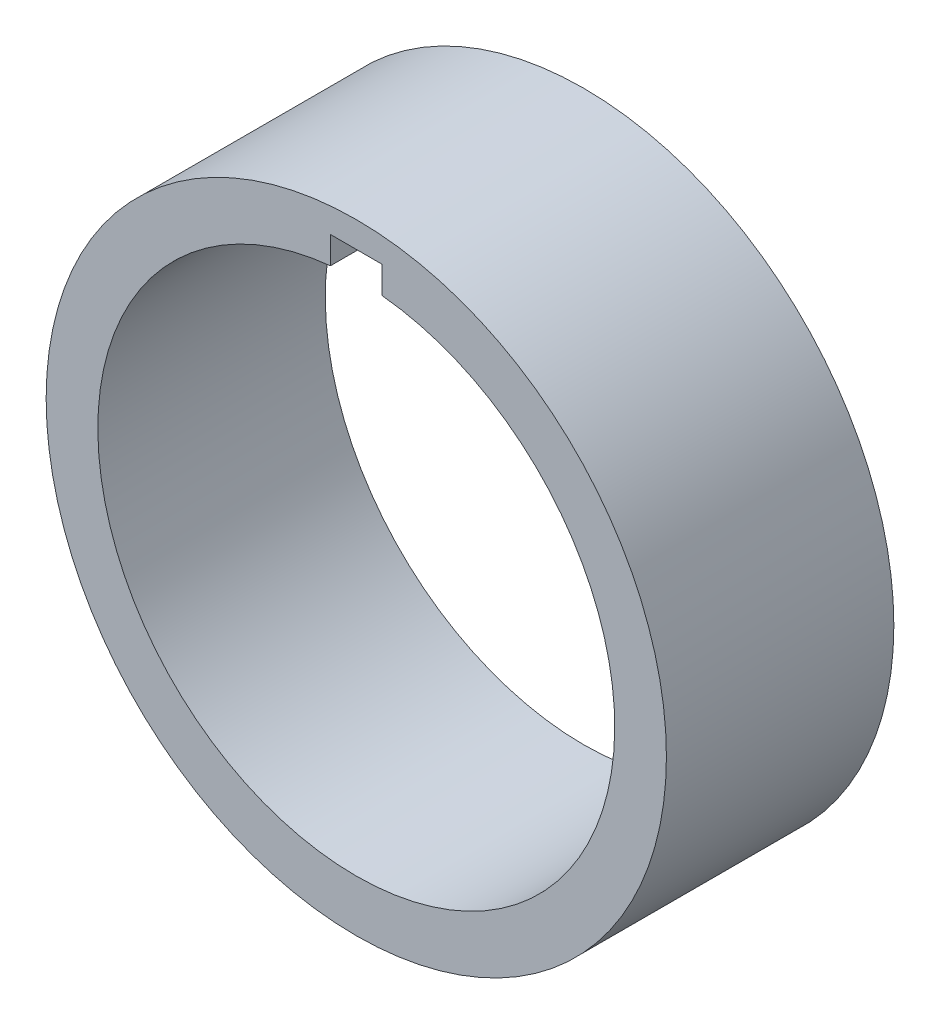
ISO-10303-21;
HEADER;
FILE_DESCRIPTION(('STEP AP214'),'2;1');
FILE_NAME('part.step','',(''),(''),'','','');
FILE_SCHEMA(('AUTOMOTIVE_DESIGN { 1 0 10303 214 1 1 1 1 }'));
ENDSEC;
DATA;
#1=APPLICATION_CONTEXT('core data for automotive mechanical design processes');
#2=APPLICATION_PROTOCOL_DEFINITION('international standard','automotive_design',2000,#1);
#3=PRODUCT_CONTEXT('',#1,'mechanical');
#4=PRODUCT('Part','Part','',(#3));
#5=PRODUCT_RELATED_PRODUCT_CATEGORY('part','',(#4));
#6=PRODUCT_DEFINITION_FORMATION('','',#4);
#7=PRODUCT_DEFINITION_CONTEXT('part definition',#1,'design');
#8=PRODUCT_DEFINITION('design','',#6,#7);
#9=PRODUCT_DEFINITION_SHAPE('','',#8);
#10=(LENGTH_UNIT() NAMED_UNIT(*) SI_UNIT(.MILLI.,.METRE.));
#11=(NAMED_UNIT(*) PLANE_ANGLE_UNIT() SI_UNIT($,.RADIAN.));
#12=(NAMED_UNIT(*) SI_UNIT($,.STERADIAN.) SOLID_ANGLE_UNIT());
#13=UNCERTAINTY_MEASURE_WITH_UNIT(LENGTH_MEASURE(1.E-05),#10,'distance_accuracy_value','');
#14=(GEOMETRIC_REPRESENTATION_CONTEXT(3) GLOBAL_UNCERTAINTY_ASSIGNED_CONTEXT((#13)) GLOBAL_UNIT_ASSIGNED_CONTEXT((#10,
#11,#12)) REPRESENTATION_CONTEXT('',''));
#15=CARTESIAN_POINT('',(0.,0.,0.));
#16=DIRECTION('',(0.,0.,1.));
#17=DIRECTION('',(1.,0.,0.));
#18=AXIS2_PLACEMENT_3D('',#15,#16,#17);
#19=CARTESIAN_POINT('',(0.,0.,22.));
#20=DIRECTION('',(0.,0.,-1.));
#21=DIRECTION('',(-1.,0.,0.));
#22=AXIS2_PLACEMENT_3D('',#19,#20,#21);
#23=CYLINDRICAL_SURFACE('',#22,30.);
#24=CARTESIAN_POINT('',(0.,0.,22.));
#25=DIRECTION('',(0.,0.,1.));
#26=DIRECTION('',(1.,0.,0.));
#27=AXIS2_PLACEMENT_3D('',#24,#25,#26);
#28=CIRCLE('',#27,30.);
#29=CARTESIAN_POINT('',(30.,0.,22.));
#30=VERTEX_POINT('',#29);
#31=EDGE_CURVE('E12',#30,#30,#28,.T.);
#32=ORIENTED_EDGE('',*,*,#31,.F.);
#33=EDGE_LOOP('',(#32));
#34=FACE_BOUND('',#33,.T.);
#35=CARTESIAN_POINT('',(0.,0.,0.));
#36=DIRECTION('',(0.,0.,1.));
#37=DIRECTION('',(1.,0.,0.));
#38=AXIS2_PLACEMENT_3D('',#35,#36,#37);
#39=CIRCLE('',#38,30.);
#40=CARTESIAN_POINT('',(30.,0.,0.));
#41=VERTEX_POINT('',#40);
#42=EDGE_CURVE('E56',#41,#41,#39,.T.);
#43=ORIENTED_EDGE('',*,*,#42,.T.);
#44=EDGE_LOOP('',(#43));
#45=FACE_BOUND('',#44,.T.);
#46=ADVANCED_FACE('F57',(#34,#45),#23,.T.);
#47=CARTESIAN_POINT('',(0.,0.,22.));
#48=DIRECTION('',(0.,0.,1.));
#49=DIRECTION('',(1.,0.,0.));
#50=AXIS2_PLACEMENT_3D('',#47,#48,#49);
#51=PLANE('',#50);
#52=DIRECTION('',(0.,1.,0.));
#53=VECTOR('',#52,1.);
#54=CARTESIAN_POINT('',(-2.5,24.8746859276655,22.));
#55=LINE('',#54,#53);
#56=CARTESIAN_POINT('',(-2.5,24.8746859276655,22.));
#57=VERTEX_POINT('',#56);
#58=CARTESIAN_POINT('',(-2.5,27.5,22.));
#59=VERTEX_POINT('',#58);
#60=EDGE_CURVE('E97',#57,#59,#55,.T.);
#61=ORIENTED_EDGE('',*,*,#60,.T.);
#62=DIRECTION('',(1.,0.,0.));
#63=VECTOR('',#62,1.);
#64=CARTESIAN_POINT('',(-2.5,27.5,22.));
#65=LINE('',#64,#63);
#66=CARTESIAN_POINT('',(2.5,27.5,22.));
#67=VERTEX_POINT('',#66);
#68=EDGE_CURVE('E107',#59,#67,#65,.T.);
#69=ORIENTED_EDGE('',*,*,#68,.T.);
#70=DIRECTION('',(0.,-1.,0.));
#71=VECTOR('',#70,1.);
#72=CARTESIAN_POINT('',(2.5,27.5,22.));
#73=LINE('',#72,#71);
#74=CARTESIAN_POINT('',(2.5,24.8746859276655,22.));
#75=VERTEX_POINT('',#74);
#76=EDGE_CURVE('E69',#67,#75,#73,.T.);
#77=ORIENTED_EDGE('',*,*,#76,.T.);
#78=CARTESIAN_POINT('',(0.,0.,22.));
#79=DIRECTION('',(0.,0.,1.));
#80=DIRECTION('',(1.,0.,0.));
#81=AXIS2_PLACEMENT_3D('',#78,#79,#80);
#82=CIRCLE('',#81,25.);
#83=EDGE_CURVE('E104',#57,#75,#82,.T.);
#84=ORIENTED_EDGE('',*,*,#83,.F.);
#85=EDGE_LOOP('',(#61,#69,#77,#84));
#86=FACE_BOUND('',#85,.T.);
#87=ORIENTED_EDGE('',*,*,#31,.T.);
#88=EDGE_LOOP('',(#87));
#89=FACE_BOUND('',#88,.T.);
#90=ADVANCED_FACE('F115',(#86,#89),#51,.T.);
#91=CARTESIAN_POINT('',(0.,0.,0.));
#92=DIRECTION('',(0.,0.,1.));
#93=DIRECTION('',(1.,0.,0.));
#94=AXIS2_PLACEMENT_3D('',#91,#92,#93);
#95=PLANE('',#94);
#96=DIRECTION('',(1.,0.,0.));
#97=VECTOR('',#96,1.);
#98=CARTESIAN_POINT('',(-2.5,27.5,0.));
#99=LINE('',#98,#97);
#100=CARTESIAN_POINT('',(-2.5,27.5,0.));
#101=VERTEX_POINT('',#100);
#102=CARTESIAN_POINT('',(2.5,27.5,0.));
#103=VERTEX_POINT('',#102);
#104=EDGE_CURVE('E122',#101,#103,#99,.T.);
#105=ORIENTED_EDGE('',*,*,#104,.F.);
#106=DIRECTION('',(0.,1.,0.));
#107=VECTOR('',#106,1.);
#108=CARTESIAN_POINT('',(-2.5,24.8746859276655,0.));
#109=LINE('',#108,#107);
#110=CARTESIAN_POINT('',(-2.5,24.8746859276655,0.));
#111=VERTEX_POINT('',#110);
#112=EDGE_CURVE('E79',#111,#101,#109,.T.);
#113=ORIENTED_EDGE('',*,*,#112,.F.);
#114=CARTESIAN_POINT('',(0.,0.,0.));
#115=DIRECTION('',(0.,0.,1.));
#116=DIRECTION('',(1.,0.,0.));
#117=AXIS2_PLACEMENT_3D('',#114,#115,#116);
#118=CIRCLE('',#117,25.);
#119=CARTESIAN_POINT('',(2.5,24.8746859276655,0.));
#120=VERTEX_POINT('',#119);
#121=EDGE_CURVE('E111',#111,#120,#118,.T.);
#122=ORIENTED_EDGE('',*,*,#121,.T.);
#123=DIRECTION('',(0.,-1.,0.));
#124=VECTOR('',#123,1.);
#125=CARTESIAN_POINT('',(2.5,27.5,0.));
#126=LINE('',#125,#124);
#127=EDGE_CURVE('E120',#103,#120,#126,.T.);
#128=ORIENTED_EDGE('',*,*,#127,.F.);
#129=EDGE_LOOP('',(#105,#113,#122,#128));
#130=FACE_BOUND('',#129,.T.);
#131=ORIENTED_EDGE('',*,*,#42,.F.);
#132=EDGE_LOOP('',(#131));
#133=FACE_BOUND('',#132,.T.);
#134=ADVANCED_FACE('F131',(#130,#133),#95,.F.);
#135=CARTESIAN_POINT('',(-2.5,24.8746859276655,22.));
#136=DIRECTION('',(-1.,0.,0.));
#137=DIRECTION('',(0.,0.,1.));
#138=AXIS2_PLACEMENT_3D('',#135,#136,#137);
#139=PLANE('',#138);
#140=ORIENTED_EDGE('',*,*,#112,.T.);
#141=DIRECTION('',(0.,0.,-1.));
#142=VECTOR('',#141,1.);
#143=CARTESIAN_POINT('',(-2.5,27.5,22.));
#144=LINE('',#143,#142);
#145=EDGE_CURVE('E92',#59,#101,#144,.T.);
#146=ORIENTED_EDGE('',*,*,#145,.F.);
#147=ORIENTED_EDGE('',*,*,#60,.F.);
#148=DIRECTION('',(0.,0.,-1.));
#149=VECTOR('',#148,1.);
#150=CARTESIAN_POINT('',(-2.5,24.8746859276655,22.));
#151=LINE('',#150,#149);
#152=EDGE_CURVE('E130',#57,#111,#151,.T.);
#153=ORIENTED_EDGE('',*,*,#152,.T.);
#154=EDGE_LOOP('',(#140,#146,#147,#153));
#155=FACE_BOUND('',#154,.T.);
#156=ADVANCED_FACE('F100',(#155),#139,.F.);
#157=CARTESIAN_POINT('',(0.,0.,22.));
#158=DIRECTION('',(0.,0.,-1.));
#159=DIRECTION('',(-1.,0.,0.));
#160=AXIS2_PLACEMENT_3D('',#157,#158,#159);
#161=CYLINDRICAL_SURFACE('',#160,25.);
#162=ORIENTED_EDGE('',*,*,#121,.F.);
#163=ORIENTED_EDGE('',*,*,#152,.F.);
#164=ORIENTED_EDGE('',*,*,#83,.T.);
#165=DIRECTION('',(0.,0.,-1.));
#166=VECTOR('',#165,1.);
#167=CARTESIAN_POINT('',(2.5,24.8746859276655,22.));
#168=LINE('',#167,#166);
#169=EDGE_CURVE('E129',#75,#120,#168,.T.);
#170=ORIENTED_EDGE('',*,*,#169,.T.);
#171=EDGE_LOOP('',(#162,#163,#164,#170));
#172=FACE_BOUND('',#171,.T.);
#173=ADVANCED_FACE('F137',(#172),#161,.F.);
#174=CARTESIAN_POINT('',(2.5,27.5,22.));
#175=DIRECTION('',(1.,0.,0.));
#176=DIRECTION('',(0.,0.,-1.));
#177=AXIS2_PLACEMENT_3D('',#174,#175,#176);
#178=PLANE('',#177);
#179=ORIENTED_EDGE('',*,*,#127,.T.);
#180=ORIENTED_EDGE('',*,*,#169,.F.);
#181=ORIENTED_EDGE('',*,*,#76,.F.);
#182=DIRECTION('',(0.,0.,-1.));
#183=VECTOR('',#182,1.);
#184=CARTESIAN_POINT('',(2.5,27.5,22.));
#185=LINE('',#184,#183);
#186=EDGE_CURVE('E102',#67,#103,#185,.T.);
#187=ORIENTED_EDGE('',*,*,#186,.T.);
#188=EDGE_LOOP('',(#179,#180,#181,#187));
#189=FACE_BOUND('',#188,.T.);
#190=ADVANCED_FACE('F132',(#189),#178,.F.);
#191=CARTESIAN_POINT('',(-2.5,27.5,22.));
#192=DIRECTION('',(0.,1.,0.));
#193=DIRECTION('',(0.,0.,1.));
#194=AXIS2_PLACEMENT_3D('',#191,#192,#193);
#195=PLANE('',#194);
#196=ORIENTED_EDGE('',*,*,#104,.T.);
#197=ORIENTED_EDGE('',*,*,#186,.F.);
#198=ORIENTED_EDGE('',*,*,#68,.F.);
#199=ORIENTED_EDGE('',*,*,#145,.T.);
#200=EDGE_LOOP('',(#196,#197,#198,#199));
#201=FACE_BOUND('',#200,.T.);
#202=ADVANCED_FACE('F108',(#201),#195,.F.);
#203=CLOSED_SHELL('',(#46,#90,#134,#156,#173,#190,#202));
#204=MANIFOLD_SOLID_BREP('B2',#203);
#205=ADVANCED_BREP_SHAPE_REPRESENTATION('',(#18,#204),#14);
#206=SHAPE_DEFINITION_REPRESENTATION(#9,#205);
ENDSEC;
END-ISO-10303-21;
